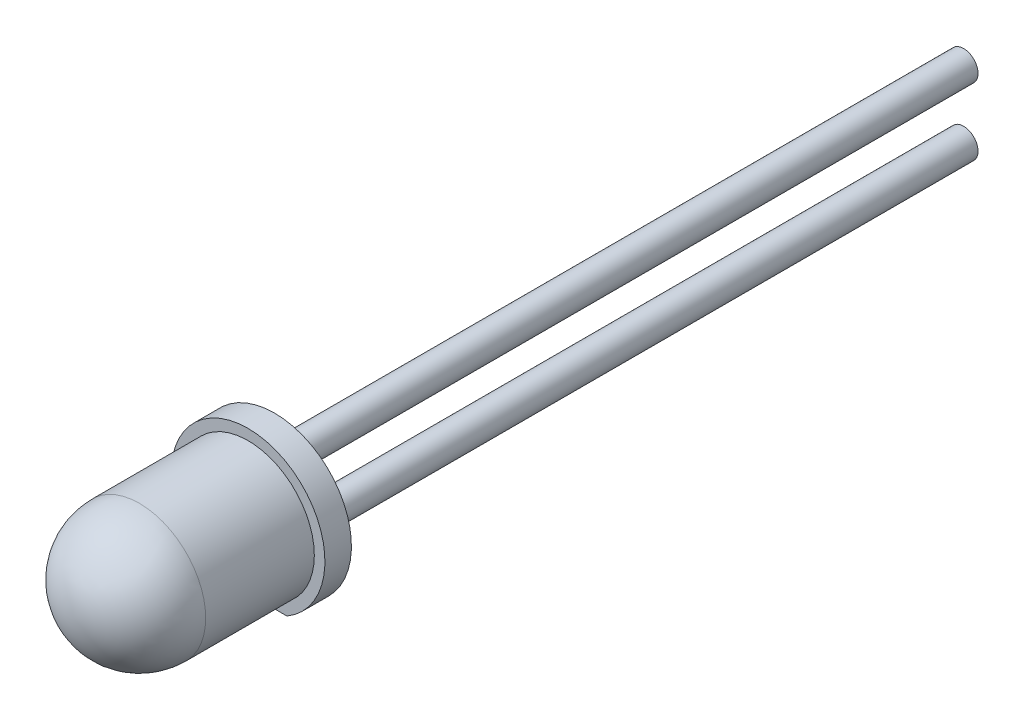
ISO-10303-21;
HEADER;
FILE_DESCRIPTION(('STEP AP214'),'2;1');
FILE_NAME('part.step','',(''),(''),'','','');
FILE_SCHEMA(('AUTOMOTIVE_DESIGN { 1 0 10303 214 1 1 1 1 }'));
ENDSEC;
DATA;
#1=APPLICATION_CONTEXT('core data for automotive mechanical design processes');
#2=APPLICATION_PROTOCOL_DEFINITION('international standard','automotive_design',2000,#1);
#3=PRODUCT_CONTEXT('',#1,'mechanical');
#4=PRODUCT('Part','Part','',(#3));
#5=PRODUCT_RELATED_PRODUCT_CATEGORY('part','',(#4));
#6=PRODUCT_DEFINITION_FORMATION('','',#4);
#7=PRODUCT_DEFINITION_CONTEXT('part definition',#1,'design');
#8=PRODUCT_DEFINITION('design','',#6,#7);
#9=PRODUCT_DEFINITION_SHAPE('','',#8);
#10=(LENGTH_UNIT() NAMED_UNIT(*) SI_UNIT(.MILLI.,.METRE.));
#11=(NAMED_UNIT(*) PLANE_ANGLE_UNIT() SI_UNIT($,.RADIAN.));
#12=(NAMED_UNIT(*) SI_UNIT($,.STERADIAN.) SOLID_ANGLE_UNIT());
#13=UNCERTAINTY_MEASURE_WITH_UNIT(LENGTH_MEASURE(1.E-05),#10,'distance_accuracy_value','');
#14=(GEOMETRIC_REPRESENTATION_CONTEXT(3) GLOBAL_UNCERTAINTY_ASSIGNED_CONTEXT((#13)) GLOBAL_UNIT_ASSIGNED_CONTEXT((#10,
#11,#12)) REPRESENTATION_CONTEXT('',''));
#15=CARTESIAN_POINT('',(0.,0.,0.));
#16=DIRECTION('',(0.,0.,1.));
#17=DIRECTION('',(1.,0.,0.));
#18=AXIS2_PLACEMENT_3D('',#15,#16,#17);
#19=CARTESIAN_POINT('',(0.,0.,-7.6));
#20=DIRECTION('',(0.,0.,-1.));
#21=DIRECTION('',(-1.,0.,0.));
#22=AXIS2_PLACEMENT_3D('',#19,#20,#21);
#23=PLANE('',#22);
#24=CARTESIAN_POINT('',(0.,1.27,-7.6));
#25=DIRECTION('',(0.,0.,-1.));
#26=DIRECTION('',(-1.,0.,0.));
#27=AXIS2_PLACEMENT_3D('',#24,#25,#26);
#28=CIRCLE('',#27,1.045);
#29=CARTESIAN_POINT('',(-1.045,1.27,-7.6));
#30=VERTEX_POINT('',#29);
#31=EDGE_CURVE('E61',#30,#30,#28,.F.);
#32=ORIENTED_EDGE('',*,*,#31,.T.);
#33=EDGE_LOOP('',(#32));
#34=FACE_BOUND('',#33,.T.);
#35=CARTESIAN_POINT('',(0.,-1.27,-7.6));
#36=DIRECTION('',(0.,0.,-1.));
#37=DIRECTION('',(-1.,0.,0.));
#38=AXIS2_PLACEMENT_3D('',#35,#36,#37);
#39=CIRCLE('',#38,1.045);
#40=CARTESIAN_POINT('',(-1.045,-1.27,-7.6));
#41=VERTEX_POINT('',#40);
#42=EDGE_CURVE('E116',#41,#41,#39,.F.);
#43=ORIENTED_EDGE('',*,*,#42,.T.);
#44=EDGE_LOOP('',(#43));
#45=FACE_BOUND('',#44,.T.);
#46=CARTESIAN_POINT('',(0.,0.,-7.6));
#47=DIRECTION('',(0.,0.,1.));
#48=DIRECTION('',(1.,0.,0.));
#49=AXIS2_PLACEMENT_3D('',#46,#47,#48);
#50=CIRCLE('',#49,2.9);
#51=CARTESIAN_POINT('',(1.46969384566991,-2.5,-7.6));
#52=VERTEX_POINT('',#51);
#53=CARTESIAN_POINT('',(-1.46969384566991,-2.5,-7.6));
#54=VERTEX_POINT('',#53);
#55=EDGE_CURVE('E97',#52,#54,#50,.T.);
#56=ORIENTED_EDGE('',*,*,#55,.F.);
#57=DIRECTION('',(-1.,0.,0.));
#58=VECTOR('',#57,1.);
#59=CARTESIAN_POINT('',(0.,-2.5,-7.6));
#60=LINE('',#59,#58);
#61=EDGE_CURVE('E99',#52,#54,#60,.T.);
#62=ORIENTED_EDGE('',*,*,#61,.T.);
#63=EDGE_LOOP('',(#56,#62));
#64=FACE_BOUND('',#63,.T.);
#65=ADVANCED_FACE('F52',(#34,#45,#64),#23,.T.);
#66=CARTESIAN_POINT('',(0.,0.,0.));
#67=DIRECTION('',(0.,0.,1.));
#68=DIRECTION('',(1.,0.,0.));
#69=AXIS2_PLACEMENT_3D('',#66,#67,#68);
#70=CYLINDRICAL_SURFACE('',#69,2.9);
#71=CARTESIAN_POINT('',(0.,0.,-6.6));
#72=DIRECTION('',(0.,0.,1.));
#73=DIRECTION('',(1.,0.,0.));
#74=AXIS2_PLACEMENT_3D('',#71,#72,#73);
#75=CIRCLE('',#74,2.9);
#76=CARTESIAN_POINT('',(1.46969384566991,-2.5,-6.6));
#77=VERTEX_POINT('',#76);
#78=CARTESIAN_POINT('',(-1.46969384566991,-2.5,-6.6));
#79=VERTEX_POINT('',#78);
#80=EDGE_CURVE('E95',#77,#79,#75,.T.);
#81=ORIENTED_EDGE('',*,*,#80,.F.);
#82=DIRECTION('',(0.,0.,1.));
#83=VECTOR('',#82,1.);
#84=CARTESIAN_POINT('',(1.46969384566991,-2.5,0.));
#85=LINE('',#84,#83);
#86=EDGE_CURVE('E73',#77,#52,#85,.F.);
#87=ORIENTED_EDGE('',*,*,#86,.T.);
#88=ORIENTED_EDGE('',*,*,#55,.T.);
#89=DIRECTION('',(0.,0.,1.));
#90=VECTOR('',#89,1.);
#91=CARTESIAN_POINT('',(-1.46969384566991,-2.5,0.));
#92=LINE('',#91,#90);
#93=EDGE_CURVE('E83',#54,#79,#92,.T.);
#94=ORIENTED_EDGE('',*,*,#93,.T.);
#95=EDGE_LOOP('',(#81,#87,#88,#94));
#96=FACE_BOUND('',#95,.T.);
#97=ADVANCED_FACE('F94',(#96),#70,.T.);
#98=CARTESIAN_POINT('',(0.,0.,-6.6));
#99=DIRECTION('',(0.,0.,-1.));
#100=DIRECTION('',(-1.,0.,0.));
#101=AXIS2_PLACEMENT_3D('',#98,#99,#100);
#102=PLANE('',#101);
#103=DIRECTION('',(-1.,0.,0.));
#104=VECTOR('',#103,1.);
#105=CARTESIAN_POINT('',(0.,-2.5,-6.6));
#106=LINE('',#105,#104);
#107=CARTESIAN_POINT('',(0.,-2.5,-6.6));
#108=VERTEX_POINT('',#107);
#109=EDGE_CURVE('E68',#77,#108,#106,.T.);
#110=ORIENTED_EDGE('',*,*,#109,.F.);
#111=ORIENTED_EDGE('',*,*,#80,.T.);
#112=EDGE_CURVE('E80',#108,#79,#106,.T.);
#113=ORIENTED_EDGE('',*,*,#112,.F.);
#114=CARTESIAN_POINT('',(0.,0.,-6.6));
#115=DIRECTION('',(0.,0.,1.));
#116=DIRECTION('',(1.,0.,0.));
#117=AXIS2_PLACEMENT_3D('',#114,#115,#116);
#118=CIRCLE('',#117,2.5);
#119=EDGE_CURVE('E103',#108,#108,#118,.T.);
#120=ORIENTED_EDGE('',*,*,#119,.F.);
#121=EDGE_LOOP('',(#110,#111,#113,#120));
#122=FACE_BOUND('',#121,.T.);
#123=ADVANCED_FACE('F101',(#122),#102,.F.);
#124=CARTESIAN_POINT('',(0.,0.,-2.5));
#125=DIRECTION('',(0.,0.,1.));
#126=DIRECTION('',(0.,1.,0.));
#127=AXIS2_PLACEMENT_3D('',#124,#125,#126);
#128=SPHERICAL_SURFACE('',#127,2.5);
#129=CARTESIAN_POINT('',(0.,0.,-2.5));
#130=DIRECTION('',(0.,0.,1.));
#131=DIRECTION('',(1.,0.,0.));
#132=AXIS2_PLACEMENT_3D('',#129,#130,#131);
#133=CIRCLE('',#132,2.5);
#134=CARTESIAN_POINT('',(2.5,0.,-2.5));
#135=VERTEX_POINT('',#134);
#136=EDGE_CURVE('E109',#135,#135,#133,.T.);
#137=ORIENTED_EDGE('',*,*,#136,.T.);
#138=EDGE_LOOP('',(#137));
#139=FACE_BOUND('',#138,.T.);
#140=ADVANCED_FACE('F162',(#139),#128,.T.);
#141=CARTESIAN_POINT('',(0.,0.,0.));
#142=DIRECTION('',(0.,0.,1.));
#143=DIRECTION('',(1.,0.,0.));
#144=AXIS2_PLACEMENT_3D('',#141,#142,#143);
#145=CYLINDRICAL_SURFACE('',#144,2.5);
#146=ORIENTED_EDGE('',*,*,#119,.T.);
#147=EDGE_LOOP('',(#146));
#148=FACE_BOUND('',#147,.T.);
#149=ORIENTED_EDGE('',*,*,#136,.F.);
#150=EDGE_LOOP('',(#149));
#151=FACE_BOUND('',#150,.T.);
#152=ADVANCED_FACE('F134',(#148,#151),#145,.T.);
#153=CARTESIAN_POINT('',(0.,1.27,-33.6));
#154=DIRECTION('',(0.,0.,1.));
#155=DIRECTION('',(1.,0.,0.));
#156=AXIS2_PLACEMENT_3D('',#153,#154,#155);
#157=CYLINDRICAL_SURFACE('',#156,0.545);
#158=CARTESIAN_POINT('',(0.,1.27,-8.1));
#159=DIRECTION('',(0.,0.,-1.));
#160=DIRECTION('',(-1.,0.,0.));
#161=AXIS2_PLACEMENT_3D('',#158,#159,#160);
#162=CIRCLE('',#161,0.545);
#163=CARTESIAN_POINT('',(-0.544999999999999,1.27,-8.1));
#164=VERTEX_POINT('',#163);
#165=EDGE_CURVE('E107',#164,#164,#162,.T.);
#166=ORIENTED_EDGE('',*,*,#165,.T.);
#167=EDGE_LOOP('',(#166));
#168=FACE_BOUND('',#167,.T.);
#169=CARTESIAN_POINT('',(0.,1.27,-33.6));
#170=DIRECTION('',(0.,0.,-1.));
#171=DIRECTION('',(-1.,0.,0.));
#172=AXIS2_PLACEMENT_3D('',#169,#170,#171);
#173=CIRCLE('',#172,0.545);
#174=CARTESIAN_POINT('',(-0.544999999999999,1.27,-33.6));
#175=VERTEX_POINT('',#174);
#176=EDGE_CURVE('E138',#175,#175,#173,.T.);
#177=ORIENTED_EDGE('',*,*,#176,.F.);
#178=EDGE_LOOP('',(#177));
#179=FACE_BOUND('',#178,.T.);
#180=ADVANCED_FACE('F130',(#168,#179),#157,.T.);
#181=CARTESIAN_POINT('',(0.,1.27,-33.6));
#182=DIRECTION('',(0.,0.,-1.));
#183=DIRECTION('',(-1.,0.,0.));
#184=AXIS2_PLACEMENT_3D('',#181,#182,#183);
#185=PLANE('',#184);
#186=ORIENTED_EDGE('',*,*,#176,.T.);
#187=EDGE_LOOP('',(#186));
#188=FACE_BOUND('',#187,.T.);
#189=ADVANCED_FACE('F133',(#188),#185,.T.);
#190=CARTESIAN_POINT('',(0.,-1.27,-33.6));
#191=DIRECTION('',(0.,0.,1.));
#192=DIRECTION('',(1.,0.,0.));
#193=AXIS2_PLACEMENT_3D('',#190,#191,#192);
#194=CYLINDRICAL_SURFACE('',#193,0.545);
#195=CARTESIAN_POINT('',(0.,-1.27,-8.1));
#196=DIRECTION('',(0.,0.,-1.));
#197=DIRECTION('',(-1.,0.,0.));
#198=AXIS2_PLACEMENT_3D('',#195,#196,#197);
#199=CIRCLE('',#198,0.545);
#200=CARTESIAN_POINT('',(-0.545,-1.27,-8.1));
#201=VERTEX_POINT('',#200);
#202=EDGE_CURVE('E11',#201,#201,#199,.T.);
#203=ORIENTED_EDGE('',*,*,#202,.T.);
#204=EDGE_LOOP('',(#203));
#205=FACE_BOUND('',#204,.T.);
#206=CARTESIAN_POINT('',(0.,-1.27,-33.6));
#207=DIRECTION('',(0.,0.,-1.));
#208=DIRECTION('',(-1.,0.,0.));
#209=AXIS2_PLACEMENT_3D('',#206,#207,#208);
#210=CIRCLE('',#209,0.545);
#211=CARTESIAN_POINT('',(-0.545,-1.27,-33.6));
#212=VERTEX_POINT('',#211);
#213=EDGE_CURVE('E141',#212,#212,#210,.T.);
#214=ORIENTED_EDGE('',*,*,#213,.F.);
#215=EDGE_LOOP('',(#214));
#216=FACE_BOUND('',#215,.T.);
#217=ADVANCED_FACE('F178',(#205,#216),#194,.T.);
#218=CARTESIAN_POINT('',(0.,-1.27,-33.6));
#219=DIRECTION('',(0.,0.,-1.));
#220=DIRECTION('',(-1.,0.,0.));
#221=AXIS2_PLACEMENT_3D('',#218,#219,#220);
#222=PLANE('',#221);
#223=ORIENTED_EDGE('',*,*,#213,.T.);
#224=EDGE_LOOP('',(#223));
#225=FACE_BOUND('',#224,.T.);
#226=ADVANCED_FACE('F179',(#225),#222,.T.);
#227=CARTESIAN_POINT('',(0.,-2.5,0.));
#228=DIRECTION('',(0.,-1.,0.));
#229=DIRECTION('',(0.,0.,-1.));
#230=AXIS2_PLACEMENT_3D('',#227,#228,#229);
#231=PLANE('',#230);
#232=ORIENTED_EDGE('',*,*,#109,.T.);
#233=ORIENTED_EDGE('',*,*,#112,.T.);
#234=ORIENTED_EDGE('',*,*,#93,.F.);
#235=ORIENTED_EDGE('',*,*,#61,.F.);
#236=ORIENTED_EDGE('',*,*,#86,.F.);
#237=EDGE_LOOP('',(#232,#233,#234,#235,#236));
#238=FACE_BOUND('',#237,.T.);
#239=ADVANCED_FACE('F82',(#238),#231,.T.);
#240=CARTESIAN_POINT('',(0.,1.27,-8.1));
#241=DIRECTION('',(0.,0.,-1.));
#242=DIRECTION('',(-1.,0.,0.));
#243=AXIS2_PLACEMENT_3D('',#240,#241,#242);
#244=TOROIDAL_SURFACE('',#243,1.045,0.5);
#245=ORIENTED_EDGE('',*,*,#31,.F.);
#246=EDGE_LOOP('',(#245));
#247=FACE_BOUND('',#246,.T.);
#248=ORIENTED_EDGE('',*,*,#165,.F.);
#249=EDGE_LOOP('',(#248));
#250=FACE_BOUND('',#249,.T.);
#251=ADVANCED_FACE('F125',(#247,#250),#244,.F.);
#252=CARTESIAN_POINT('',(0.,-1.27,-8.1));
#253=DIRECTION('',(0.,0.,-1.));
#254=DIRECTION('',(-1.,0.,0.));
#255=AXIS2_PLACEMENT_3D('',#252,#253,#254);
#256=TOROIDAL_SURFACE('',#255,1.045,0.5);
#257=ORIENTED_EDGE('',*,*,#42,.F.);
#258=EDGE_LOOP('',(#257));
#259=FACE_BOUND('',#258,.T.);
#260=ORIENTED_EDGE('',*,*,#202,.F.);
#261=EDGE_LOOP('',(#260));
#262=FACE_BOUND('',#261,.T.);
#263=ADVANCED_FACE('F54',(#259,#262),#256,.F.);
#264=CLOSED_SHELL('',(#65,#97,#123,#140,#152,#180,#189,#217,#226,#239,#251,#263));
#265=MANIFOLD_SOLID_BREP('B2',#264);
#266=ADVANCED_BREP_SHAPE_REPRESENTATION('',(#18,#265),#14);
#267=SHAPE_DEFINITION_REPRESENTATION(#9,#266);
ENDSEC;
END-ISO-10303-21;
